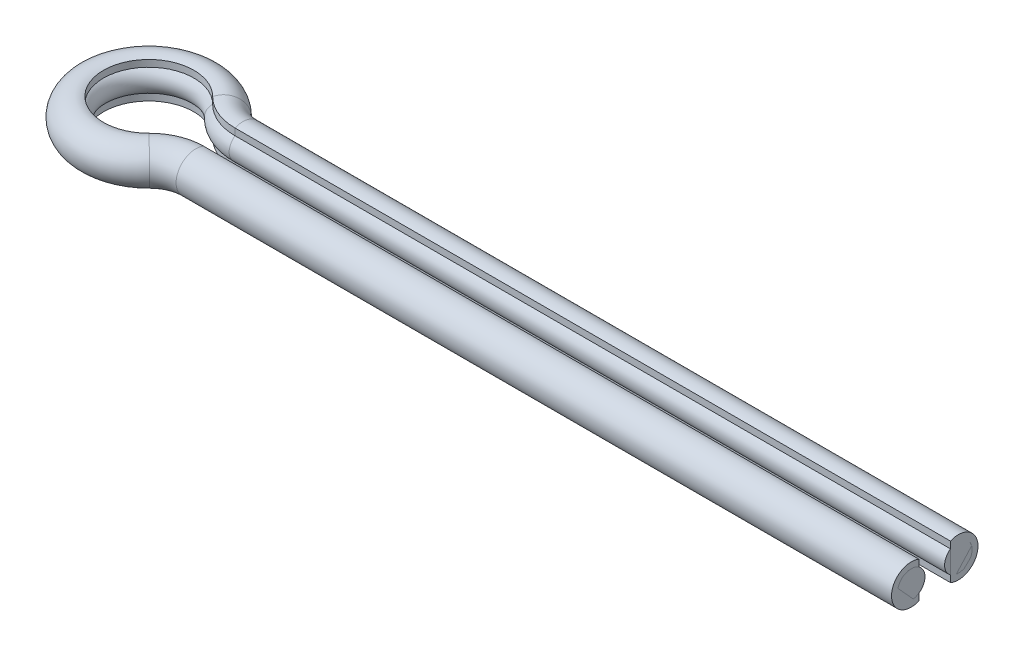
ISO-10303-21;
HEADER;
FILE_DESCRIPTION(('STEP AP214'),'2;1');
FILE_NAME('part.step','',(''),(''),'','','');
FILE_SCHEMA(('AUTOMOTIVE_DESIGN { 1 0 10303 214 1 1 1 1 }'));
ENDSEC;
DATA;
#1=APPLICATION_CONTEXT('core data for automotive mechanical design processes');
#2=APPLICATION_PROTOCOL_DEFINITION('international standard','automotive_design',2000,#1);
#3=PRODUCT_CONTEXT('',#1,'mechanical');
#4=PRODUCT('Part','Part','',(#3));
#5=PRODUCT_RELATED_PRODUCT_CATEGORY('part','',(#4));
#6=PRODUCT_DEFINITION_FORMATION('','',#4);
#7=PRODUCT_DEFINITION_CONTEXT('part definition',#1,'design');
#8=PRODUCT_DEFINITION('design','',#6,#7);
#9=PRODUCT_DEFINITION_SHAPE('','',#8);
#10=(LENGTH_UNIT() NAMED_UNIT(*) SI_UNIT(.MILLI.,.METRE.));
#11=(NAMED_UNIT(*) PLANE_ANGLE_UNIT() SI_UNIT($,.RADIAN.));
#12=(NAMED_UNIT(*) SI_UNIT($,.STERADIAN.) SOLID_ANGLE_UNIT());
#13=UNCERTAINTY_MEASURE_WITH_UNIT(LENGTH_MEASURE(1.E-05),#10,'distance_accuracy_value','');
#14=(GEOMETRIC_REPRESENTATION_CONTEXT(3) GLOBAL_UNCERTAINTY_ASSIGNED_CONTEXT((#13)) GLOBAL_UNIT_ASSIGNED_CONTEXT((#10,
#11,#12)) REPRESENTATION_CONTEXT('',''));
#15=CARTESIAN_POINT('',(0.,0.,0.));
#16=DIRECTION('',(0.,0.,1.));
#17=DIRECTION('',(1.,0.,0.));
#18=AXIS2_PLACEMENT_3D('',#15,#16,#17);
#19=CARTESIAN_POINT('',(50.,0.,3.));
#20=DIRECTION('',(-1.,0.,0.));
#21=DIRECTION('',(0.,0.,1.));
#22=AXIS2_PLACEMENT_3D('',#19,#20,#21);
#23=PLANE('',#22);
#24=CARTESIAN_POINT('',(50.,0.,3.));
#25=DIRECTION('',(-1.,0.,0.));
#26=DIRECTION('',(0.,0.,1.));
#27=AXIS2_PLACEMENT_3D('',#24,#25,#26);
#28=CIRCLE('',#27,2.5);
#29=CARTESIAN_POINT('',(50.,-2.29128784747792,2.));
#30=VERTEX_POINT('',#29);
#31=CARTESIAN_POINT('',(50.,2.29128784747792,2.));
#32=VERTEX_POINT('',#31);
#33=EDGE_CURVE('E100',#30,#32,#28,.T.);
#34=ORIENTED_EDGE('',*,*,#33,.F.);
#35=DIRECTION('',(0.,-1.,0.));
#36=VECTOR('',#35,1.);
#37=CARTESIAN_POINT('',(50.,2.29128784747792,2.));
#38=LINE('',#37,#36);
#39=EDGE_CURVE('E102',#32,#30,#38,.T.);
#40=ORIENTED_EDGE('',*,*,#39,.F.);
#41=EDGE_LOOP('',(#34,#40));
#42=FACE_BOUND('',#41,.T.);
#43=ADVANCED_FACE('F53',(#42),#23,.F.);
#44=CARTESIAN_POINT('',(50.,0.,-3.));
#45=DIRECTION('',(1.,0.,0.));
#46=DIRECTION('',(0.,0.,-1.));
#47=AXIS2_PLACEMENT_3D('',#44,#45,#46);
#48=PLANE('',#47);
#49=CARTESIAN_POINT('',(50.,0.,-3.));
#50=DIRECTION('',(1.,0.,0.));
#51=DIRECTION('',(0.,0.,-1.));
#52=AXIS2_PLACEMENT_3D('',#49,#50,#51);
#53=CIRCLE('',#52,2.5);
#54=CARTESIAN_POINT('',(50.,-2.29128784747792,-2.));
#55=VERTEX_POINT('',#54);
#56=CARTESIAN_POINT('',(50.,2.29128784747792,-2.));
#57=VERTEX_POINT('',#56);
#58=EDGE_CURVE('E66',#55,#57,#53,.T.);
#59=ORIENTED_EDGE('',*,*,#58,.T.);
#60=DIRECTION('',(0.,-1.,0.));
#61=VECTOR('',#60,1.);
#62=CARTESIAN_POINT('',(50.,2.29128784747792,-2.));
#63=LINE('',#62,#61);
#64=EDGE_CURVE('E12',#57,#55,#63,.T.);
#65=ORIENTED_EDGE('',*,*,#64,.T.);
#66=EDGE_LOOP('',(#59,#65));
#67=FACE_BOUND('',#66,.T.);
#68=ADVANCED_FACE('F226',(#67),#48,.T.);
#69=CARTESIAN_POINT('',(50.,0.,3.));
#70=DIRECTION('',(-1.,0.,0.));
#71=DIRECTION('',(0.,0.,1.));
#72=AXIS2_PLACEMENT_3D('',#69,#70,#71);
#73=CYLINDRICAL_SURFACE('',#72,2.5);
#74=DIRECTION('',(-1.,0.,0.));
#75=VECTOR('',#74,1.);
#76=CARTESIAN_POINT('',(50.,2.29128784747792,2.));
#77=LINE('',#76,#75);
#78=CARTESIAN_POINT('',(-41.020857501966,2.29128784747792,2.));
#79=VERTEX_POINT('',#78);
#80=EDGE_CURVE('E114',#32,#79,#77,.T.);
#81=ORIENTED_EDGE('',*,*,#80,.T.);
#82=CARTESIAN_POINT('',(-41.020857501966,0.,3.));
#83=DIRECTION('',(-1.,0.,0.));
#84=DIRECTION('',(0.,0.,1.));
#85=AXIS2_PLACEMENT_3D('',#82,#83,#84);
#86=CIRCLE('',#85,2.5);
#87=CARTESIAN_POINT('',(-41.020857501966,-2.29128784747792,2.));
#88=VERTEX_POINT('',#87);
#89=EDGE_CURVE('E120',#88,#79,#86,.T.);
#90=ORIENTED_EDGE('',*,*,#89,.F.);
#91=DIRECTION('',(-1.,0.,0.));
#92=VECTOR('',#91,1.);
#93=CARTESIAN_POINT('',(50.,-2.29128784747792,2.));
#94=LINE('',#93,#92);
#95=EDGE_CURVE('E113',#30,#88,#94,.T.);
#96=ORIENTED_EDGE('',*,*,#95,.F.);
#97=ORIENTED_EDGE('',*,*,#33,.T.);
#98=EDGE_LOOP('',(#81,#90,#96,#97));
#99=FACE_BOUND('',#98,.T.);
#100=ADVANCED_FACE('F118',(#99),#73,.T.);
#101=CARTESIAN_POINT('',(50.,2.29128784747792,2.));
#102=DIRECTION('',(0.,0.,-1.));
#103=DIRECTION('',(0.,1.,0.));
#104=AXIS2_PLACEMENT_3D('',#101,#102,#103);
#105=PLANE('',#104);
#106=DIRECTION('',(0.,-1.,0.));
#107=VECTOR('',#106,1.);
#108=CARTESIAN_POINT('',(-41.020857501966,2.29128784747792,2.));
#109=LINE('',#108,#107);
#110=EDGE_CURVE('E140',#79,#88,#109,.T.);
#111=ORIENTED_EDGE('',*,*,#110,.F.);
#112=ORIENTED_EDGE('',*,*,#80,.F.);
#113=ORIENTED_EDGE('',*,*,#39,.T.);
#114=ORIENTED_EDGE('',*,*,#95,.T.);
#115=EDGE_LOOP('',(#111,#112,#113,#114));
#116=FACE_BOUND('',#115,.T.);
#117=ADVANCED_FACE('F112',(#116),#105,.T.);
#118=CARTESIAN_POINT('',(-41.020857501966,0.,8.875));
#119=DIRECTION('',(0.,1.,0.));
#120=DIRECTION('',(0.,0.,1.));
#121=AXIS2_PLACEMENT_3D('',#118,#119,#120);
#122=TOROIDAL_SURFACE('',#121,5.875,2.5);
#123=CARTESIAN_POINT('',(-41.020857501966,2.29128784747792,8.875));
#124=DIRECTION('',(0.,1.,0.));
#125=DIRECTION('',(0.,0.,-1.));
#126=AXIS2_PLACEMENT_3D('',#123,#124,#125);
#127=CIRCLE('',#126,6.875);
#128=CARTESIAN_POINT('',(-45.9104895553509,2.29128784747792,4.04207920792079));
#129=VERTEX_POINT('',#128);
#130=EDGE_CURVE('E131',#79,#129,#127,.T.);
#131=ORIENTED_EDGE('',*,*,#130,.T.);
#132=CARTESIAN_POINT('',(-45.1992703475858,0.,4.74504950495049));
#133=DIRECTION('',(-0.702970297029703,0.,0.711219207765068));
#134=DIRECTION('',(0.711219207765068,0.,0.702970297029703));
#135=AXIS2_PLACEMENT_3D('',#132,#133,#134);
#136=CIRCLE('',#135,2.5);
#137=CARTESIAN_POINT('',(-45.9104895553509,-2.29128784747792,4.04207920792079));
#138=VERTEX_POINT('',#137);
#139=EDGE_CURVE('E127',#138,#129,#136,.T.);
#140=ORIENTED_EDGE('',*,*,#139,.F.);
#141=CARTESIAN_POINT('',(-41.020857501966,-2.29128784747792,8.875));
#142=DIRECTION('',(0.,1.,0.));
#143=DIRECTION('',(0.,0.,-1.));
#144=AXIS2_PLACEMENT_3D('',#141,#142,#143);
#145=CIRCLE('',#144,6.875);
#146=EDGE_CURVE('E132',#88,#138,#145,.T.);
#147=ORIENTED_EDGE('',*,*,#146,.F.);
#148=ORIENTED_EDGE('',*,*,#89,.T.);
#149=EDGE_LOOP('',(#131,#140,#147,#148));
#150=FACE_BOUND('',#149,.T.);
#151=ADVANCED_FACE('F205',(#150),#122,.T.);
#152=CARTESIAN_POINT('',(-41.020857501966,0.,8.875));
#153=DIRECTION('',(0.,1.,0.));
#154=DIRECTION('',(0.,0.,1.));
#155=AXIS2_PLACEMENT_3D('',#152,#153,#154);
#156=CYLINDRICAL_SURFACE('',#155,6.875);
#157=DIRECTION('',(0.,-1.,0.));
#158=VECTOR('',#157,1.);
#159=CARTESIAN_POINT('',(-45.9104895553509,2.29128784747792,4.04207920792079));
#160=LINE('',#159,#158);
#161=EDGE_CURVE('E136',#129,#138,#160,.T.);
#162=ORIENTED_EDGE('',*,*,#161,.F.);
#163=ORIENTED_EDGE('',*,*,#130,.F.);
#164=ORIENTED_EDGE('',*,*,#110,.T.);
#165=ORIENTED_EDGE('',*,*,#146,.T.);
#166=EDGE_LOOP('',(#162,#163,#164,#165));
#167=FACE_BOUND('',#166,.T.);
#168=ADVANCED_FACE('F206',(#167),#156,.T.);
#169=CARTESIAN_POINT('',(-50.,0.,0.));
#170=DIRECTION('',(0.,-1.,0.));
#171=DIRECTION('',(0.,0.,-1.));
#172=AXIS2_PLACEMENT_3D('',#169,#170,#171);
#173=TOROIDAL_SURFACE('',#172,6.75,2.5);
#174=CARTESIAN_POINT('',(-50.,2.29128784747792,0.));
#175=DIRECTION('',(0.,-1.,0.));
#176=DIRECTION('',(0.711219207765068,0.,0.702970297029703));
#177=AXIS2_PLACEMENT_3D('',#174,#175,#176);
#178=CIRCLE('',#177,5.75);
#179=CARTESIAN_POINT('',(-45.9104895553509,2.29128784747792,-4.0420792079208));
#180=VERTEX_POINT('',#179);
#181=EDGE_CURVE('E145',#129,#180,#178,.T.);
#182=ORIENTED_EDGE('',*,*,#181,.T.);
#183=CARTESIAN_POINT('',(-45.1992703475858,0.,-4.7450495049505));
#184=DIRECTION('',(0.702970297029704,0.,0.711219207765067));
#185=DIRECTION('',(0.711219207765067,0.,-0.702970297029704));
#186=AXIS2_PLACEMENT_3D('',#183,#184,#185);
#187=CIRCLE('',#186,2.5);
#188=CARTESIAN_POINT('',(-45.9104895553509,-2.29128784747792,-4.0420792079208));
#189=VERTEX_POINT('',#188);
#190=EDGE_CURVE('E141',#189,#180,#187,.T.);
#191=ORIENTED_EDGE('',*,*,#190,.F.);
#192=CARTESIAN_POINT('',(-50.,-2.29128784747792,0.));
#193=DIRECTION('',(0.,-1.,0.));
#194=DIRECTION('',(0.711219207765068,0.,0.702970297029703));
#195=AXIS2_PLACEMENT_3D('',#192,#193,#194);
#196=CIRCLE('',#195,5.75);
#197=EDGE_CURVE('E146',#138,#189,#196,.T.);
#198=ORIENTED_EDGE('',*,*,#197,.F.);
#199=ORIENTED_EDGE('',*,*,#139,.T.);
#200=EDGE_LOOP('',(#182,#191,#198,#199));
#201=FACE_BOUND('',#200,.T.);
#202=ADVANCED_FACE('F199',(#201),#173,.T.);
#203=CARTESIAN_POINT('',(-50.,0.,0.));
#204=DIRECTION('',(0.,-1.,0.));
#205=DIRECTION('',(0.,0.,-1.));
#206=AXIS2_PLACEMENT_3D('',#203,#204,#205);
#207=CYLINDRICAL_SURFACE('',#206,5.75);
#208=DIRECTION('',(0.,-1.,0.));
#209=VECTOR('',#208,1.);
#210=CARTESIAN_POINT('',(-45.9104895553509,2.29128784747792,-4.0420792079208));
#211=LINE('',#210,#209);
#212=EDGE_CURVE('E150',#180,#189,#211,.T.);
#213=ORIENTED_EDGE('',*,*,#212,.F.);
#214=ORIENTED_EDGE('',*,*,#181,.F.);
#215=ORIENTED_EDGE('',*,*,#161,.T.);
#216=ORIENTED_EDGE('',*,*,#197,.T.);
#217=EDGE_LOOP('',(#213,#214,#215,#216));
#218=FACE_BOUND('',#217,.T.);
#219=ADVANCED_FACE('F200',(#218),#207,.F.);
#220=CARTESIAN_POINT('',(-41.020857501966,0.,-8.875));
#221=DIRECTION('',(0.,1.,0.));
#222=DIRECTION('',(0.,0.,1.));
#223=AXIS2_PLACEMENT_3D('',#220,#221,#222);
#224=TOROIDAL_SURFACE('',#223,5.87500000000001,2.5);
#225=CARTESIAN_POINT('',(-41.020857501966,2.29128784747792,-8.875));
#226=DIRECTION('',(0.,1.,0.));
#227=DIRECTION('',(-0.711219207765068,0.,0.702970297029703));
#228=AXIS2_PLACEMENT_3D('',#225,#226,#227);
#229=CIRCLE('',#228,6.87500000000001);
#230=CARTESIAN_POINT('',(-41.020857501966,2.29128784747792,-1.99999999999999));
#231=VERTEX_POINT('',#230);
#232=EDGE_CURVE('E158',#180,#231,#229,.T.);
#233=ORIENTED_EDGE('',*,*,#232,.T.);
#234=CARTESIAN_POINT('',(-41.020857501966,0.,-3.));
#235=DIRECTION('',(1.,0.,0.));
#236=DIRECTION('',(0.,0.,-1.));
#237=AXIS2_PLACEMENT_3D('',#234,#235,#236);
#238=CIRCLE('',#237,2.5);
#239=CARTESIAN_POINT('',(-41.020857501966,-2.29128784747792,-1.99999999999999));
#240=VERTEX_POINT('',#239);
#241=EDGE_CURVE('E154',#240,#231,#238,.T.);
#242=ORIENTED_EDGE('',*,*,#241,.F.);
#243=CARTESIAN_POINT('',(-41.020857501966,-2.29128784747792,-8.875));
#244=DIRECTION('',(0.,1.,0.));
#245=DIRECTION('',(-0.711219207765068,0.,0.702970297029703));
#246=AXIS2_PLACEMENT_3D('',#243,#244,#245);
#247=CIRCLE('',#246,6.87500000000001);
#248=EDGE_CURVE('E159',#189,#240,#247,.T.);
#249=ORIENTED_EDGE('',*,*,#248,.F.);
#250=ORIENTED_EDGE('',*,*,#190,.T.);
#251=EDGE_LOOP('',(#233,#242,#249,#250));
#252=FACE_BOUND('',#251,.T.);
#253=ADVANCED_FACE('F192',(#252),#224,.T.);
#254=CARTESIAN_POINT('',(-41.020857501966,0.,-8.875));
#255=DIRECTION('',(0.,1.,0.));
#256=DIRECTION('',(0.,0.,1.));
#257=AXIS2_PLACEMENT_3D('',#254,#255,#256);
#258=CYLINDRICAL_SURFACE('',#257,6.87500000000001);
#259=DIRECTION('',(0.,-1.,0.));
#260=VECTOR('',#259,1.);
#261=CARTESIAN_POINT('',(-41.020857501966,2.29128784747792,-2.));
#262=LINE('',#261,#260);
#263=EDGE_CURVE('E163',#231,#240,#262,.T.);
#264=ORIENTED_EDGE('',*,*,#263,.F.);
#265=ORIENTED_EDGE('',*,*,#232,.F.);
#266=ORIENTED_EDGE('',*,*,#212,.T.);
#267=ORIENTED_EDGE('',*,*,#248,.T.);
#268=EDGE_LOOP('',(#264,#265,#266,#267));
#269=FACE_BOUND('',#268,.T.);
#270=ADVANCED_FACE('F194',(#269),#258,.T.);
#271=CARTESIAN_POINT('',(-41.020857501966,0.,-3.));
#272=DIRECTION('',(1.,0.,0.));
#273=DIRECTION('',(0.,0.,-1.));
#274=AXIS2_PLACEMENT_3D('',#271,#272,#273);
#275=CYLINDRICAL_SURFACE('',#274,2.5);
#276=DIRECTION('',(1.,0.,0.));
#277=VECTOR('',#276,1.);
#278=CARTESIAN_POINT('',(-41.020857501966,2.29128784747792,-2.));
#279=LINE('',#278,#277);
#280=EDGE_CURVE('E61',#231,#57,#279,.T.);
#281=ORIENTED_EDGE('',*,*,#280,.T.);
#282=ORIENTED_EDGE('',*,*,#58,.F.);
#283=DIRECTION('',(1.,0.,0.));
#284=VECTOR('',#283,1.);
#285=CARTESIAN_POINT('',(-41.020857501966,-2.29128784747792,-2.));
#286=LINE('',#285,#284);
#287=EDGE_CURVE('E169',#240,#55,#286,.T.);
#288=ORIENTED_EDGE('',*,*,#287,.F.);
#289=ORIENTED_EDGE('',*,*,#241,.T.);
#290=EDGE_LOOP('',(#281,#282,#288,#289));
#291=FACE_BOUND('',#290,.T.);
#292=ADVANCED_FACE('F219',(#291),#275,.T.);
#293=CARTESIAN_POINT('',(-41.020857501966,2.29128784747792,-2.));
#294=DIRECTION('',(0.,0.,1.));
#295=DIRECTION('',(0.,-1.,0.));
#296=AXIS2_PLACEMENT_3D('',#293,#294,#295);
#297=PLANE('',#296);
#298=ORIENTED_EDGE('',*,*,#64,.F.);
#299=ORIENTED_EDGE('',*,*,#280,.F.);
#300=ORIENTED_EDGE('',*,*,#263,.T.);
#301=ORIENTED_EDGE('',*,*,#287,.T.);
#302=EDGE_LOOP('',(#298,#299,#300,#301));
#303=FACE_BOUND('',#302,.T.);
#304=ADVANCED_FACE('F189',(#303),#297,.T.);
#305=CLOSED_SHELL('',(#43,#68,#100,#117,#151,#168,#202,#219,#253,#270,#292,#304));
#306=MANIFOLD_SOLID_BREP('B2',#305);
#307=CARTESIAN_POINT('',(50.,0.,3.));
#308=DIRECTION('',(-1.,0.,0.));
#309=DIRECTION('',(0.,0.,1.));
#310=AXIS2_PLACEMENT_3D('',#307,#308,#309);
#311=PLANE('',#310);
#312=CARTESIAN_POINT('',(50.,0.,3.));
#313=DIRECTION('',(-1.,0.,0.));
#314=DIRECTION('',(0.,0.,1.));
#315=AXIS2_PLACEMENT_3D('',#312,#313,#314);
#316=CIRCLE('',#315,1.75);
#317=CARTESIAN_POINT('',(50.,0.,4.75));
#318=VERTEX_POINT('',#317);
#319=EDGE_CURVE('E353',#318,#318,#316,.T.);
#320=ORIENTED_EDGE('',*,*,#319,.F.);
#321=EDGE_LOOP('',(#320));
#322=FACE_BOUND('',#321,.T.);
#323=ADVANCED_FACE('F331',(#322),#311,.F.);
#324=CARTESIAN_POINT('',(50.,0.,-3.));
#325=DIRECTION('',(1.,0.,0.));
#326=DIRECTION('',(0.,0.,-1.));
#327=AXIS2_PLACEMENT_3D('',#324,#325,#326);
#328=PLANE('',#327);
#329=CARTESIAN_POINT('',(50.,0.,-3.));
#330=DIRECTION('',(1.,0.,0.));
#331=DIRECTION('',(0.,0.,-1.));
#332=AXIS2_PLACEMENT_3D('',#329,#330,#331);
#333=CIRCLE('',#332,1.75);
#334=CARTESIAN_POINT('',(50.,0.,-4.75));
#335=VERTEX_POINT('',#334);
#336=EDGE_CURVE('E52',#335,#335,#333,.T.);
#337=ORIENTED_EDGE('',*,*,#336,.T.);
#338=EDGE_LOOP('',(#337));
#339=FACE_BOUND('',#338,.T.);
#340=ADVANCED_FACE('F360',(#339),#328,.T.);
#341=CARTESIAN_POINT('',(50.,0.,3.));
#342=DIRECTION('',(-1.,0.,0.));
#343=DIRECTION('',(0.,0.,1.));
#344=AXIS2_PLACEMENT_3D('',#341,#342,#343);
#345=CYLINDRICAL_SURFACE('',#344,1.75);
#346=CARTESIAN_POINT('',(-41.020857501966,0.,3.));
#347=DIRECTION('',(-1.,0.,0.));
#348=DIRECTION('',(0.,0.,1.));
#349=AXIS2_PLACEMENT_3D('',#346,#347,#348);
#350=CIRCLE('',#349,1.75);
#351=CARTESIAN_POINT('',(-41.020857501966,0.,1.25));
#352=VERTEX_POINT('',#351);
#353=EDGE_CURVE('E350',#352,#352,#350,.T.);
#354=ORIENTED_EDGE('',*,*,#353,.F.);
#355=EDGE_LOOP('',(#354));
#356=FACE_BOUND('',#355,.T.);
#357=ORIENTED_EDGE('',*,*,#319,.T.);
#358=EDGE_LOOP('',(#357));
#359=FACE_BOUND('',#358,.T.);
#360=ADVANCED_FACE('F357',(#356,#359),#345,.T.);
#361=CARTESIAN_POINT('',(-41.020857501966,0.,8.875));
#362=DIRECTION('',(0.,1.,0.));
#363=DIRECTION('',(0.,0.,1.));
#364=AXIS2_PLACEMENT_3D('',#361,#362,#363);
#365=TOROIDAL_SURFACE('',#364,5.875,1.75);
#366=CARTESIAN_POINT('',(-45.1992703475858,0.,4.74504950495049));
#367=DIRECTION('',(-0.702970297029703,0.,0.711219207765068));
#368=DIRECTION('',(0.711219207765068,0.,0.702970297029703));
#369=AXIS2_PLACEMENT_3D('',#366,#367,#368);
#370=CIRCLE('',#369,1.75);
#371=CARTESIAN_POINT('',(-46.4439039611747,0.,3.51485148514851));
#372=VERTEX_POINT('',#371);
#373=EDGE_CURVE('E345',#372,#372,#370,.T.);
#374=CARTESIAN_POINT('',(-41.020857501966,0.,8.875));
#375=DIRECTION('',(0.,1.,0.));
#376=DIRECTION('',(0.,0.,1.));
#377=AXIS2_PLACEMENT_3D('',#374,#375,#376);
#378=CIRCLE('',#377,7.625);
#379=EDGE_CURVE('',#352,#372,#378,.T.);
#380=ORIENTED_EDGE('',*,*,#353,.T.);
#381=ORIENTED_EDGE('',*,*,#373,.F.);
#382=ORIENTED_EDGE('',*,*,#379,.T.);
#383=ORIENTED_EDGE('',*,*,#379,.F.);
#384=EDGE_LOOP('',(#380,#382,#381,#383));
#385=FACE_BOUND('',#384,.T.);
#386=ADVANCED_FACE('F378',(#385),#365,.T.);
#387=CARTESIAN_POINT('',(-50.,0.,0.));
#388=DIRECTION('',(0.,-1.,0.));
#389=DIRECTION('',(0.,0.,-1.));
#390=AXIS2_PLACEMENT_3D('',#387,#388,#389);
#391=TOROIDAL_SURFACE('',#390,6.75,1.75);
#392=CARTESIAN_POINT('',(-45.1992703475858,0.,-4.7450495049505));
#393=DIRECTION('',(0.702970297029704,0.,0.711219207765067));
#394=DIRECTION('',(0.711219207765067,0.,-0.702970297029704));
#395=AXIS2_PLACEMENT_3D('',#392,#393,#394);
#396=CIRCLE('',#395,1.75);
#397=CARTESIAN_POINT('',(-46.4439039611747,0.,-3.51485148514852));
#398=VERTEX_POINT('',#397);
#399=EDGE_CURVE('E341',#398,#398,#396,.T.);
#400=ORIENTED_EDGE('',*,*,#399,.F.);
#401=EDGE_LOOP('',(#400));
#402=FACE_BOUND('',#401,.T.);
#403=ORIENTED_EDGE('',*,*,#373,.T.);
#404=EDGE_LOOP('',(#403));
#405=FACE_BOUND('',#404,.T.);
#406=ADVANCED_FACE('F372',(#402,#405),#391,.T.);
#407=CARTESIAN_POINT('',(-41.020857501966,0.,-8.875));
#408=DIRECTION('',(0.,1.,0.));
#409=DIRECTION('',(0.,0.,1.));
#410=AXIS2_PLACEMENT_3D('',#407,#408,#409);
#411=TOROIDAL_SURFACE('',#410,5.87500000000001,1.75);
#412=CARTESIAN_POINT('',(-41.020857501966,0.,-3.));
#413=DIRECTION('',(1.,0.,0.));
#414=DIRECTION('',(0.,0.,-1.));
#415=AXIS2_PLACEMENT_3D('',#412,#413,#414);
#416=CIRCLE('',#415,1.75);
#417=CARTESIAN_POINT('',(-41.020857501966,0.,-1.24999999999999));
#418=VERTEX_POINT('',#417);
#419=EDGE_CURVE('E337',#418,#418,#416,.T.);
#420=CARTESIAN_POINT('',(-41.020857501966,0.,-8.875));
#421=DIRECTION('',(0.,1.,0.));
#422=DIRECTION('',(0.,0.,1.));
#423=AXIS2_PLACEMENT_3D('',#420,#421,#422);
#424=CIRCLE('',#423,7.62500000000001);
#425=EDGE_CURVE('',#398,#418,#424,.T.);
#426=ORIENTED_EDGE('',*,*,#399,.T.);
#427=ORIENTED_EDGE('',*,*,#419,.F.);
#428=ORIENTED_EDGE('',*,*,#425,.T.);
#429=ORIENTED_EDGE('',*,*,#425,.F.);
#430=EDGE_LOOP('',(#426,#428,#427,#429));
#431=FACE_BOUND('',#430,.T.);
#432=ADVANCED_FACE('F366',(#431),#411,.T.);
#433=CARTESIAN_POINT('',(-41.020857501966,0.,-3.));
#434=DIRECTION('',(1.,0.,0.));
#435=DIRECTION('',(0.,0.,-1.));
#436=AXIS2_PLACEMENT_3D('',#433,#434,#435);
#437=CYLINDRICAL_SURFACE('',#436,1.75);
#438=ORIENTED_EDGE('',*,*,#336,.F.);
#439=EDGE_LOOP('',(#438));
#440=FACE_BOUND('',#439,.T.);
#441=ORIENTED_EDGE('',*,*,#419,.T.);
#442=EDGE_LOOP('',(#441));
#443=FACE_BOUND('',#442,.T.);
#444=ADVANCED_FACE('F364',(#440,#443),#437,.T.);
#445=CLOSED_SHELL('',(#323,#340,#360,#386,#406,#432,#444));
#446=MANIFOLD_SOLID_BREP('B6_NOT_SHOWN',#445);
#447=ADVANCED_BREP_SHAPE_REPRESENTATION('',(#18,#306,#446),#14);
#448=SHAPE_DEFINITION_REPRESENTATION(#9,#447);
ENDSEC;
END-ISO-10303-21;
